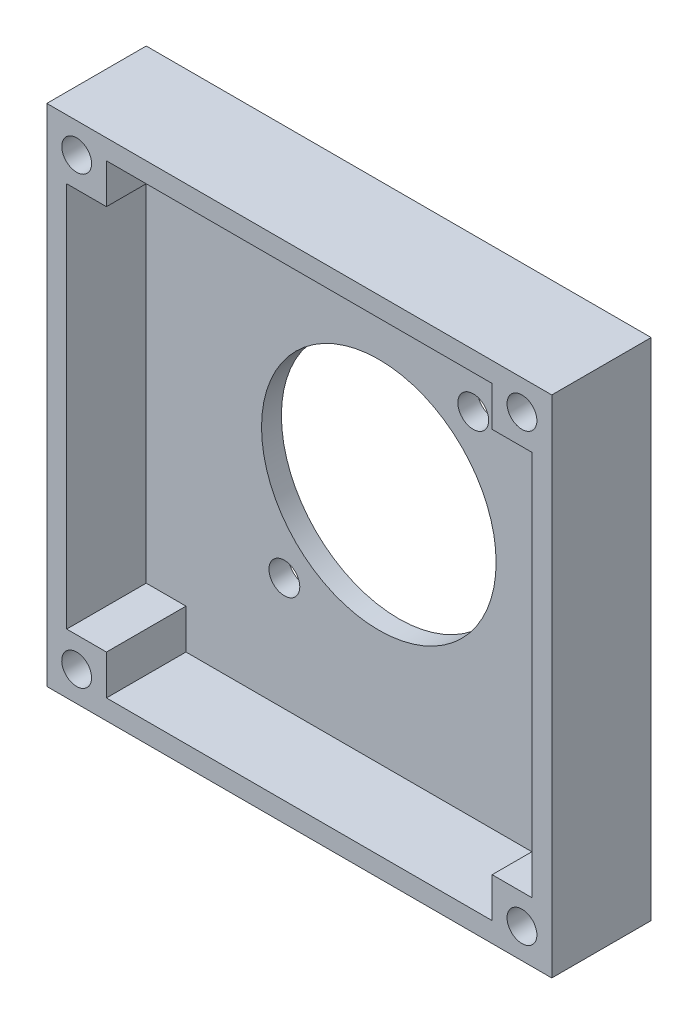
ISO-10303-21;
HEADER;
FILE_DESCRIPTION(('STEP AP214'),'2;1');
FILE_NAME('part.step','',(''),(''),'','','');
FILE_SCHEMA(('AUTOMOTIVE_DESIGN { 1 0 10303 214 1 1 1 1 }'));
ENDSEC;
DATA;
#1=APPLICATION_CONTEXT('core data for automotive mechanical design processes');
#2=APPLICATION_PROTOCOL_DEFINITION('international standard','automotive_design',2000,#1);
#3=PRODUCT_CONTEXT('',#1,'mechanical');
#4=PRODUCT('Part','Part','',(#3));
#5=PRODUCT_RELATED_PRODUCT_CATEGORY('part','',(#4));
#6=PRODUCT_DEFINITION_FORMATION('','',#4);
#7=PRODUCT_DEFINITION_CONTEXT('part definition',#1,'design');
#8=PRODUCT_DEFINITION('design','',#6,#7);
#9=PRODUCT_DEFINITION_SHAPE('','',#8);
#10=(LENGTH_UNIT() NAMED_UNIT(*) SI_UNIT(.MILLI.,.METRE.));
#11=(NAMED_UNIT(*) PLANE_ANGLE_UNIT() SI_UNIT($,.RADIAN.));
#12=(NAMED_UNIT(*) SI_UNIT($,.STERADIAN.) SOLID_ANGLE_UNIT());
#13=UNCERTAINTY_MEASURE_WITH_UNIT(LENGTH_MEASURE(1.E-05),#10,'distance_accuracy_value','');
#14=(GEOMETRIC_REPRESENTATION_CONTEXT(3) GLOBAL_UNCERTAINTY_ASSIGNED_CONTEXT((#13)) GLOBAL_UNIT_ASSIGNED_CONTEXT((#10,
#11,#12)) REPRESENTATION_CONTEXT('',''));
#15=CARTESIAN_POINT('',(0.,0.,0.));
#16=DIRECTION('',(0.,0.,1.));
#17=DIRECTION('',(1.,0.,0.));
#18=AXIS2_PLACEMENT_3D('',#15,#16,#17);
#19=CARTESIAN_POINT('',(0.,0.,2.));
#20=DIRECTION('',(0.,0.,-1.));
#21=DIRECTION('',(-1.,0.,0.));
#22=AXIS2_PLACEMENT_3D('',#19,#20,#21);
#23=PLANE('',#22);
#24=DIRECTION('',(1.,0.,0.));
#25=VECTOR('',#24,1.);
#26=CARTESIAN_POINT('',(0.,23.4,2.));
#27=LINE('',#26,#25);
#28=CARTESIAN_POINT('',(-19.4,23.4,2.));
#29=VERTEX_POINT('',#28);
#30=CARTESIAN_POINT('',(19.4,23.4,2.));
#31=VERTEX_POINT('',#30);
#32=EDGE_CURVE('E669',#29,#31,#27,.T.);
#33=ORIENTED_EDGE('',*,*,#32,.F.);
#34=DIRECTION('',(0.,-1.,0.));
#35=VECTOR('',#34,1.);
#36=CARTESIAN_POINT('',(-19.4,0.,2.));
#37=LINE('',#36,#35);
#38=CARTESIAN_POINT('',(-19.4,19.4,2.));
#39=VERTEX_POINT('',#38);
#40=EDGE_CURVE('E672',#29,#39,#37,.T.);
#41=ORIENTED_EDGE('',*,*,#40,.T.);
#42=DIRECTION('',(1.,0.,0.));
#43=VECTOR('',#42,1.);
#44=CARTESIAN_POINT('',(0.,19.4,2.));
#45=LINE('',#44,#43);
#46=CARTESIAN_POINT('',(-23.4,19.4,2.));
#47=VERTEX_POINT('',#46);
#48=EDGE_CURVE('E640',#47,#39,#45,.T.);
#49=ORIENTED_EDGE('',*,*,#48,.F.);
#50=DIRECTION('',(0.,1.,0.));
#51=VECTOR('',#50,1.);
#52=CARTESIAN_POINT('',(-23.4,0.,2.));
#53=LINE('',#52,#51);
#54=CARTESIAN_POINT('',(-23.4,-19.4,2.));
#55=VERTEX_POINT('',#54);
#56=EDGE_CURVE('E647',#55,#47,#53,.T.);
#57=ORIENTED_EDGE('',*,*,#56,.F.);
#58=DIRECTION('',(1.,0.,0.));
#59=VECTOR('',#58,1.);
#60=CARTESIAN_POINT('',(0.,-19.4,2.));
#61=LINE('',#60,#59);
#62=CARTESIAN_POINT('',(-19.4,-19.4,2.));
#63=VERTEX_POINT('',#62);
#64=EDGE_CURVE('E650',#55,#63,#61,.T.);
#65=ORIENTED_EDGE('',*,*,#64,.T.);
#66=DIRECTION('',(0.,1.,0.));
#67=VECTOR('',#66,1.);
#68=CARTESIAN_POINT('',(-19.4,0.,2.));
#69=LINE('',#68,#67);
#70=CARTESIAN_POINT('',(-19.4,-23.4,2.));
#71=VERTEX_POINT('',#70);
#72=EDGE_CURVE('E652',#71,#63,#69,.T.);
#73=ORIENTED_EDGE('',*,*,#72,.F.);
#74=DIRECTION('',(1.,0.,0.));
#75=VECTOR('',#74,1.);
#76=CARTESIAN_POINT('',(0.,-23.4,2.));
#77=LINE('',#76,#75);
#78=CARTESIAN_POINT('',(19.4,-23.4,2.));
#79=VERTEX_POINT('',#78);
#80=EDGE_CURVE('E655',#71,#79,#77,.T.);
#81=ORIENTED_EDGE('',*,*,#80,.T.);
#82=DIRECTION('',(0.,1.,0.));
#83=VECTOR('',#82,1.);
#84=CARTESIAN_POINT('',(19.4,0.,2.));
#85=LINE('',#84,#83);
#86=CARTESIAN_POINT('',(19.4,-19.4,2.));
#87=VERTEX_POINT('',#86);
#88=EDGE_CURVE('E657',#79,#87,#85,.T.);
#89=ORIENTED_EDGE('',*,*,#88,.T.);
#90=DIRECTION('',(-1.,0.,0.));
#91=VECTOR('',#90,1.);
#92=CARTESIAN_POINT('',(0.,-19.4,2.));
#93=LINE('',#92,#91);
#94=CARTESIAN_POINT('',(23.4,-19.4,2.));
#95=VERTEX_POINT('',#94);
#96=EDGE_CURVE('E659',#95,#87,#93,.T.);
#97=ORIENTED_EDGE('',*,*,#96,.F.);
#98=DIRECTION('',(0.,1.,0.));
#99=VECTOR('',#98,1.);
#100=CARTESIAN_POINT('',(23.4,0.,2.));
#101=LINE('',#100,#99);
#102=CARTESIAN_POINT('',(23.4,19.4,2.));
#103=VERTEX_POINT('',#102);
#104=EDGE_CURVE('E662',#95,#103,#101,.T.);
#105=ORIENTED_EDGE('',*,*,#104,.T.);
#106=DIRECTION('',(-1.,0.,0.));
#107=VECTOR('',#106,1.);
#108=CARTESIAN_POINT('',(0.,19.4,2.));
#109=LINE('',#108,#107);
#110=CARTESIAN_POINT('',(19.4,19.4,2.));
#111=VERTEX_POINT('',#110);
#112=EDGE_CURVE('E664',#103,#111,#109,.T.);
#113=ORIENTED_EDGE('',*,*,#112,.T.);
#114=DIRECTION('',(0.,-1.,0.));
#115=VECTOR('',#114,1.);
#116=CARTESIAN_POINT('',(19.4,0.,2.));
#117=LINE('',#116,#115);
#118=EDGE_CURVE('E666',#31,#111,#117,.T.);
#119=ORIENTED_EDGE('',*,*,#118,.F.);
#120=EDGE_LOOP('',(#33,#41,#49,#57,#65,#73,#81,#89,#97,#105,#113,#119));
#121=FACE_BOUND('',#120,.T.);
#122=CARTESIAN_POINT('',(0.,0.,2.));
#123=DIRECTION('',(0.,0.,1.));
#124=DIRECTION('',(1.,0.,0.));
#125=AXIS2_PLACEMENT_3D('',#122,#123,#124);
#126=CIRCLE('',#125,11.8);
#127=CARTESIAN_POINT('',(11.8,0.,2.));
#128=VERTEX_POINT('',#127);
#129=EDGE_CURVE('E558',#128,#128,#126,.T.);
#130=ORIENTED_EDGE('',*,*,#129,.F.);
#131=EDGE_LOOP('',(#130));
#132=FACE_BOUND('',#131,.T.);
#133=CARTESIAN_POINT('',(-9.5,-12.,2.));
#134=DIRECTION('',(0.,0.,1.));
#135=DIRECTION('',(1.,0.,0.));
#136=AXIS2_PLACEMENT_3D('',#133,#134,#135);
#137=CIRCLE('',#136,1.55);
#138=CARTESIAN_POINT('',(-7.94999999999999,-12.,2.));
#139=VERTEX_POINT('',#138);
#140=EDGE_CURVE('E681',#139,#139,#137,.T.);
#141=ORIENTED_EDGE('',*,*,#140,.F.);
#142=EDGE_LOOP('',(#141));
#143=FACE_BOUND('',#142,.T.);
#144=CARTESIAN_POINT('',(9.5,12.,2.));
#145=DIRECTION('',(0.,0.,1.));
#146=DIRECTION('',(1.,0.,0.));
#147=AXIS2_PLACEMENT_3D('',#144,#145,#146);
#148=CIRCLE('',#147,1.55);
#149=CARTESIAN_POINT('',(11.05,12.,2.));
#150=VERTEX_POINT('',#149);
#151=EDGE_CURVE('E675',#150,#150,#148,.T.);
#152=ORIENTED_EDGE('',*,*,#151,.F.);
#153=EDGE_LOOP('',(#152));
#154=FACE_BOUND('',#153,.T.);
#155=ADVANCED_FACE('F35',(#121,#132,#143,#154),#23,.F.);
#156=CARTESIAN_POINT('',(0.,0.,0.));
#157=DIRECTION('',(0.,0.,-1.));
#158=DIRECTION('',(-1.,0.,0.));
#159=AXIS2_PLACEMENT_3D('',#156,#157,#158);
#160=PLANE('',#159);
#161=CARTESIAN_POINT('',(-22.4,-22.5292564643802,0.));
#162=DIRECTION('',(0.,0.,1.));
#163=DIRECTION('',(-1.,0.,0.));
#164=AXIS2_PLACEMENT_3D('',#161,#162,#163);
#165=CIRCLE('',#164,1.5);
#166=CARTESIAN_POINT('',(-23.9,-22.5292564643802,0.));
#167=VERTEX_POINT('',#166);
#168=EDGE_CURVE('E163',#167,#167,#165,.T.);
#169=ORIENTED_EDGE('',*,*,#168,.T.);
#170=EDGE_LOOP('',(#169));
#171=FACE_BOUND('',#170,.T.);
#172=CARTESIAN_POINT('',(22.4,-22.5292564643802,0.));
#173=DIRECTION('',(0.,0.,1.));
#174=DIRECTION('',(1.,0.,0.));
#175=AXIS2_PLACEMENT_3D('',#172,#173,#174);
#176=CIRCLE('',#175,1.5);
#177=CARTESIAN_POINT('',(23.9,-22.5292564643802,0.));
#178=VERTEX_POINT('',#177);
#179=EDGE_CURVE('E169',#178,#178,#176,.T.);
#180=ORIENTED_EDGE('',*,*,#179,.T.);
#181=EDGE_LOOP('',(#180));
#182=FACE_BOUND('',#181,.T.);
#183=CARTESIAN_POINT('',(22.4,22.4,0.));
#184=DIRECTION('',(0.,0.,1.));
#185=DIRECTION('',(-1.,0.,0.));
#186=AXIS2_PLACEMENT_3D('',#183,#184,#185);
#187=CIRCLE('',#186,1.5);
#188=CARTESIAN_POINT('',(20.9,22.4,0.));
#189=VERTEX_POINT('',#188);
#190=EDGE_CURVE('E713',#189,#189,#187,.T.);
#191=ORIENTED_EDGE('',*,*,#190,.T.);
#192=EDGE_LOOP('',(#191));
#193=FACE_BOUND('',#192,.T.);
#194=CARTESIAN_POINT('',(-22.4,22.4,0.));
#195=DIRECTION('',(0.,0.,1.));
#196=DIRECTION('',(1.,0.,0.));
#197=AXIS2_PLACEMENT_3D('',#194,#195,#196);
#198=CIRCLE('',#197,1.5);
#199=CARTESIAN_POINT('',(-20.9,22.4,0.));
#200=VERTEX_POINT('',#199);
#201=EDGE_CURVE('E708',#200,#200,#198,.T.);
#202=ORIENTED_EDGE('',*,*,#201,.T.);
#203=EDGE_LOOP('',(#202));
#204=FACE_BOUND('',#203,.T.);
#205=CARTESIAN_POINT('',(-9.5,-12.,0.));
#206=DIRECTION('',(0.,0.,1.));
#207=DIRECTION('',(1.,0.,0.));
#208=AXIS2_PLACEMENT_3D('',#205,#206,#207);
#209=CIRCLE('',#208,1.55);
#210=CARTESIAN_POINT('',(-7.94999999999999,-12.,0.));
#211=VERTEX_POINT('',#210);
#212=EDGE_CURVE('E678',#211,#211,#209,.T.);
#213=ORIENTED_EDGE('',*,*,#212,.T.);
#214=EDGE_LOOP('',(#213));
#215=FACE_BOUND('',#214,.T.);
#216=CARTESIAN_POINT('',(0.,0.,0.));
#217=DIRECTION('',(0.,0.,1.));
#218=DIRECTION('',(1.,0.,0.));
#219=AXIS2_PLACEMENT_3D('',#216,#217,#218);
#220=CIRCLE('',#219,11.8);
#221=CARTESIAN_POINT('',(11.8,0.,0.));
#222=VERTEX_POINT('',#221);
#223=EDGE_CURVE('E563',#222,#222,#220,.T.);
#224=ORIENTED_EDGE('',*,*,#223,.T.);
#225=EDGE_LOOP('',(#224));
#226=FACE_BOUND('',#225,.T.);
#227=CARTESIAN_POINT('',(9.5,12.,0.));
#228=DIRECTION('',(0.,0.,1.));
#229=DIRECTION('',(1.,0.,0.));
#230=AXIS2_PLACEMENT_3D('',#227,#228,#229);
#231=CIRCLE('',#230,1.55);
#232=CARTESIAN_POINT('',(11.05,12.,0.));
#233=VERTEX_POINT('',#232);
#234=EDGE_CURVE('E674',#233,#233,#231,.T.);
#235=ORIENTED_EDGE('',*,*,#234,.T.);
#236=EDGE_LOOP('',(#235));
#237=FACE_BOUND('',#236,.T.);
#238=DIRECTION('',(0.,1.,0.));
#239=VECTOR('',#238,1.);
#240=CARTESIAN_POINT('',(25.4,-25.4,0.));
#241=LINE('',#240,#239);
#242=CARTESIAN_POINT('',(25.4,-25.4,0.));
#243=VERTEX_POINT('',#242);
#244=CARTESIAN_POINT('',(25.4,25.4,0.));
#245=VERTEX_POINT('',#244);
#246=EDGE_CURVE('E550',#243,#245,#241,.T.);
#247=ORIENTED_EDGE('',*,*,#246,.F.);
#248=DIRECTION('',(1.,0.,0.));
#249=VECTOR('',#248,1.);
#250=CARTESIAN_POINT('',(-25.4,-25.4,0.));
#251=LINE('',#250,#249);
#252=CARTESIAN_POINT('',(-25.4,-25.4,0.));
#253=VERTEX_POINT('',#252);
#254=EDGE_CURVE('E568',#253,#243,#251,.T.);
#255=ORIENTED_EDGE('',*,*,#254,.F.);
#256=DIRECTION('',(0.,-1.,0.));
#257=VECTOR('',#256,1.);
#258=CARTESIAN_POINT('',(-25.4,-25.4,0.));
#259=LINE('',#258,#257);
#260=CARTESIAN_POINT('',(-25.4,25.4,0.));
#261=VERTEX_POINT('',#260);
#262=EDGE_CURVE('E560',#261,#253,#259,.T.);
#263=ORIENTED_EDGE('',*,*,#262,.F.);
#264=DIRECTION('',(-1.,0.,0.));
#265=VECTOR('',#264,1.);
#266=CARTESIAN_POINT('',(-25.4,25.4,0.));
#267=LINE('',#266,#265);
#268=EDGE_CURVE('E557',#245,#261,#267,.T.);
#269=ORIENTED_EDGE('',*,*,#268,.F.);
#270=EDGE_LOOP('',(#247,#255,#263,#269));
#271=FACE_BOUND('',#270,.T.);
#272=ADVANCED_FACE('F190',(#171,#182,#193,#204,#215,#226,#237,#271),#160,.T.);
#273=CARTESIAN_POINT('',(25.4,-25.4,2.));
#274=DIRECTION('',(-1.,0.,0.));
#275=DIRECTION('',(0.,0.,1.));
#276=AXIS2_PLACEMENT_3D('',#273,#274,#275);
#277=PLANE('',#276);
#278=ORIENTED_EDGE('',*,*,#246,.T.);
#279=DIRECTION('',(0.,0.,-1.));
#280=VECTOR('',#279,1.);
#281=CARTESIAN_POINT('',(25.4,25.4,2.));
#282=LINE('',#281,#280);
#283=CARTESIAN_POINT('',(25.4,25.4,10.));
#284=VERTEX_POINT('',#283);
#285=EDGE_CURVE('E39',#284,#245,#282,.T.);
#286=ORIENTED_EDGE('',*,*,#285,.F.);
#287=DIRECTION('',(0.,1.,0.));
#288=VECTOR('',#287,1.);
#289=CARTESIAN_POINT('',(25.4,0.,10.));
#290=LINE('',#289,#288);
#291=CARTESIAN_POINT('',(25.4,-25.4,10.));
#292=VERTEX_POINT('',#291);
#293=EDGE_CURVE('E594',#292,#284,#290,.T.);
#294=ORIENTED_EDGE('',*,*,#293,.F.);
#295=DIRECTION('',(0.,0.,-1.));
#296=VECTOR('',#295,1.);
#297=CARTESIAN_POINT('',(25.4,-25.4,2.));
#298=LINE('',#297,#296);
#299=EDGE_CURVE('E554',#292,#243,#298,.T.);
#300=ORIENTED_EDGE('',*,*,#299,.T.);
#301=EDGE_LOOP('',(#278,#286,#294,#300));
#302=FACE_BOUND('',#301,.T.);
#303=ADVANCED_FACE('F37',(#302),#277,.F.);
#304=CARTESIAN_POINT('',(-25.4,25.4,2.));
#305=DIRECTION('',(0.,-1.,0.));
#306=DIRECTION('',(0.,0.,-1.));
#307=AXIS2_PLACEMENT_3D('',#304,#305,#306);
#308=PLANE('',#307);
#309=ORIENTED_EDGE('',*,*,#268,.T.);
#310=DIRECTION('',(0.,0.,-1.));
#311=VECTOR('',#310,1.);
#312=CARTESIAN_POINT('',(-25.4,25.4,2.));
#313=LINE('',#312,#311);
#314=CARTESIAN_POINT('',(-25.4,25.4,10.));
#315=VERTEX_POINT('',#314);
#316=EDGE_CURVE('E573',#315,#261,#313,.T.);
#317=ORIENTED_EDGE('',*,*,#316,.F.);
#318=DIRECTION('',(1.,0.,0.));
#319=VECTOR('',#318,1.);
#320=CARTESIAN_POINT('',(0.,25.4,10.));
#321=LINE('',#320,#319);
#322=EDGE_CURVE('E579',#315,#284,#321,.T.);
#323=ORIENTED_EDGE('',*,*,#322,.T.);
#324=ORIENTED_EDGE('',*,*,#285,.T.);
#325=EDGE_LOOP('',(#309,#317,#323,#324));
#326=FACE_BOUND('',#325,.T.);
#327=ADVANCED_FACE('F430',(#326),#308,.F.);
#328=CARTESIAN_POINT('',(-25.4,-25.4,2.));
#329=DIRECTION('',(1.,0.,0.));
#330=DIRECTION('',(0.,0.,-1.));
#331=AXIS2_PLACEMENT_3D('',#328,#329,#330);
#332=PLANE('',#331);
#333=ORIENTED_EDGE('',*,*,#262,.T.);
#334=DIRECTION('',(0.,0.,-1.));
#335=VECTOR('',#334,1.);
#336=CARTESIAN_POINT('',(-25.4,-25.4,2.));
#337=LINE('',#336,#335);
#338=CARTESIAN_POINT('',(-25.4,-25.4,10.));
#339=VERTEX_POINT('',#338);
#340=EDGE_CURVE('E571',#339,#253,#337,.T.);
#341=ORIENTED_EDGE('',*,*,#340,.F.);
#342=DIRECTION('',(0.,1.,0.));
#343=VECTOR('',#342,1.);
#344=CARTESIAN_POINT('',(-25.4,0.,10.));
#345=LINE('',#344,#343);
#346=EDGE_CURVE('E582',#339,#315,#345,.T.);
#347=ORIENTED_EDGE('',*,*,#346,.T.);
#348=ORIENTED_EDGE('',*,*,#316,.T.);
#349=EDGE_LOOP('',(#333,#341,#347,#348));
#350=FACE_BOUND('',#349,.T.);
#351=ADVANCED_FACE('F422',(#350),#332,.F.);
#352=CARTESIAN_POINT('',(-25.4,-25.4,2.));
#353=DIRECTION('',(0.,1.,0.));
#354=DIRECTION('',(0.,0.,1.));
#355=AXIS2_PLACEMENT_3D('',#352,#353,#354);
#356=PLANE('',#355);
#357=ORIENTED_EDGE('',*,*,#254,.T.);
#358=ORIENTED_EDGE('',*,*,#299,.F.);
#359=DIRECTION('',(1.,0.,0.));
#360=VECTOR('',#359,1.);
#361=CARTESIAN_POINT('',(0.,-25.4,10.));
#362=LINE('',#361,#360);
#363=EDGE_CURVE('E585',#339,#292,#362,.T.);
#364=ORIENTED_EDGE('',*,*,#363,.F.);
#365=ORIENTED_EDGE('',*,*,#340,.T.);
#366=EDGE_LOOP('',(#357,#358,#364,#365));
#367=FACE_BOUND('',#366,.T.);
#368=ADVANCED_FACE('F416',(#367),#356,.F.);
#369=CARTESIAN_POINT('',(0.,0.,2.));
#370=DIRECTION('',(0.,0.,-1.));
#371=DIRECTION('',(-1.,0.,0.));
#372=AXIS2_PLACEMENT_3D('',#369,#370,#371);
#373=CYLINDRICAL_SURFACE('',#372,11.8);
#374=ORIENTED_EDGE('',*,*,#129,.T.);
#375=EDGE_LOOP('',(#374));
#376=FACE_BOUND('',#375,.T.);
#377=ORIENTED_EDGE('',*,*,#223,.F.);
#378=EDGE_LOOP('',(#377));
#379=FACE_BOUND('',#378,.T.);
#380=ADVANCED_FACE('F408',(#376,#379),#373,.F.);
#381=CARTESIAN_POINT('',(-9.5,-12.,2.));
#382=DIRECTION('',(0.,0.,-1.));
#383=DIRECTION('',(-1.,0.,0.));
#384=AXIS2_PLACEMENT_3D('',#381,#382,#383);
#385=CYLINDRICAL_SURFACE('',#384,1.55);
#386=ORIENTED_EDGE('',*,*,#140,.T.);
#387=EDGE_LOOP('',(#386));
#388=FACE_BOUND('',#387,.T.);
#389=ORIENTED_EDGE('',*,*,#212,.F.);
#390=EDGE_LOOP('',(#389));
#391=FACE_BOUND('',#390,.T.);
#392=ADVANCED_FACE('F400',(#388,#391),#385,.F.);
#393=CARTESIAN_POINT('',(9.5,12.,2.));
#394=DIRECTION('',(0.,0.,-1.));
#395=DIRECTION('',(-1.,0.,0.));
#396=AXIS2_PLACEMENT_3D('',#393,#394,#395);
#397=CYLINDRICAL_SURFACE('',#396,1.55);
#398=ORIENTED_EDGE('',*,*,#151,.T.);
#399=EDGE_LOOP('',(#398));
#400=FACE_BOUND('',#399,.T.);
#401=ORIENTED_EDGE('',*,*,#234,.F.);
#402=EDGE_LOOP('',(#401));
#403=FACE_BOUND('',#402,.T.);
#404=ADVANCED_FACE('F391',(#400,#403),#397,.F.);
#405=CARTESIAN_POINT('',(-19.4,0.,10.));
#406=DIRECTION('',(1.,0.,0.));
#407=DIRECTION('',(0.,0.,-1.));
#408=AXIS2_PLACEMENT_3D('',#405,#406,#407);
#409=PLANE('',#408);
#410=ORIENTED_EDGE('',*,*,#40,.F.);
#411=DIRECTION('',(0.,0.,-1.));
#412=VECTOR('',#411,1.);
#413=CARTESIAN_POINT('',(-19.4,23.4,10.));
#414=LINE('',#413,#412);
#415=CARTESIAN_POINT('',(-19.4,23.4,10.));
#416=VERTEX_POINT('',#415);
#417=EDGE_CURVE('E638',#416,#29,#414,.T.);
#418=ORIENTED_EDGE('',*,*,#417,.F.);
#419=DIRECTION('',(0.,-1.,0.));
#420=VECTOR('',#419,1.);
#421=CARTESIAN_POINT('',(-19.4,0.,10.));
#422=LINE('',#421,#420);
#423=CARTESIAN_POINT('',(-19.4,19.4,10.));
#424=VERTEX_POINT('',#423);
#425=EDGE_CURVE('E705',#416,#424,#422,.T.);
#426=ORIENTED_EDGE('',*,*,#425,.T.);
#427=DIRECTION('',(0.,0.,-1.));
#428=VECTOR('',#427,1.);
#429=CARTESIAN_POINT('',(-19.4,19.4,10.));
#430=LINE('',#429,#428);
#431=EDGE_CURVE('E605',#424,#39,#430,.T.);
#432=ORIENTED_EDGE('',*,*,#431,.T.);
#433=EDGE_LOOP('',(#410,#418,#426,#432));
#434=FACE_BOUND('',#433,.T.);
#435=ADVANCED_FACE('F383',(#434),#409,.T.);
#436=CARTESIAN_POINT('',(0.,23.4,10.));
#437=DIRECTION('',(0.,1.,0.));
#438=DIRECTION('',(0.,0.,1.));
#439=AXIS2_PLACEMENT_3D('',#436,#437,#438);
#440=PLANE('',#439);
#441=ORIENTED_EDGE('',*,*,#417,.T.);
#442=ORIENTED_EDGE('',*,*,#32,.T.);
#443=DIRECTION('',(0.,0.,-1.));
#444=VECTOR('',#443,1.);
#445=CARTESIAN_POINT('',(19.4,23.4,10.));
#446=LINE('',#445,#444);
#447=CARTESIAN_POINT('',(19.4,23.4,10.));
#448=VERTEX_POINT('',#447);
#449=EDGE_CURVE('E635',#448,#31,#446,.T.);
#450=ORIENTED_EDGE('',*,*,#449,.F.);
#451=DIRECTION('',(1.,0.,0.));
#452=VECTOR('',#451,1.);
#453=CARTESIAN_POINT('',(0.,23.4,10.));
#454=LINE('',#453,#452);
#455=EDGE_CURVE('E707',#416,#448,#454,.T.);
#456=ORIENTED_EDGE('',*,*,#455,.F.);
#457=EDGE_LOOP('',(#441,#442,#450,#456));
#458=FACE_BOUND('',#457,.T.);
#459=ADVANCED_FACE('F375',(#458),#440,.F.);
#460=CARTESIAN_POINT('',(19.4,0.,10.));
#461=DIRECTION('',(1.,0.,0.));
#462=DIRECTION('',(0.,0.,-1.));
#463=AXIS2_PLACEMENT_3D('',#460,#461,#462);
#464=PLANE('',#463);
#465=ORIENTED_EDGE('',*,*,#449,.T.);
#466=ORIENTED_EDGE('',*,*,#118,.T.);
#467=DIRECTION('',(0.,0.,-1.));
#468=VECTOR('',#467,1.);
#469=CARTESIAN_POINT('',(19.4,19.4,10.));
#470=LINE('',#469,#468);
#471=CARTESIAN_POINT('',(19.4,19.4,10.));
#472=VERTEX_POINT('',#471);
#473=EDGE_CURVE('E632',#472,#111,#470,.T.);
#474=ORIENTED_EDGE('',*,*,#473,.F.);
#475=DIRECTION('',(0.,-1.,0.));
#476=VECTOR('',#475,1.);
#477=CARTESIAN_POINT('',(19.4,0.,10.));
#478=LINE('',#477,#476);
#479=EDGE_CURVE('E710',#448,#472,#478,.T.);
#480=ORIENTED_EDGE('',*,*,#479,.F.);
#481=EDGE_LOOP('',(#465,#466,#474,#480));
#482=FACE_BOUND('',#481,.T.);
#483=ADVANCED_FACE('F367',(#482),#464,.F.);
#484=CARTESIAN_POINT('',(0.,19.4,10.));
#485=DIRECTION('',(0.,-1.,0.));
#486=DIRECTION('',(0.,0.,-1.));
#487=AXIS2_PLACEMENT_3D('',#484,#485,#486);
#488=PLANE('',#487);
#489=ORIENTED_EDGE('',*,*,#112,.F.);
#490=DIRECTION('',(0.,0.,-1.));
#491=VECTOR('',#490,1.);
#492=CARTESIAN_POINT('',(23.4,19.4,10.));
#493=LINE('',#492,#491);
#494=CARTESIAN_POINT('',(23.4,19.4,10.));
#495=VERTEX_POINT('',#494);
#496=EDGE_CURVE('E629',#495,#103,#493,.T.);
#497=ORIENTED_EDGE('',*,*,#496,.F.);
#498=DIRECTION('',(-1.,0.,0.));
#499=VECTOR('',#498,1.);
#500=CARTESIAN_POINT('',(0.,19.4,10.));
#501=LINE('',#500,#499);
#502=EDGE_CURVE('E718',#495,#472,#501,.T.);
#503=ORIENTED_EDGE('',*,*,#502,.T.);
#504=ORIENTED_EDGE('',*,*,#473,.T.);
#505=EDGE_LOOP('',(#489,#497,#503,#504));
#506=FACE_BOUND('',#505,.T.);
#507=ADVANCED_FACE('F359',(#506),#488,.T.);
#508=CARTESIAN_POINT('',(23.4,0.,10.));
#509=DIRECTION('',(-1.,0.,0.));
#510=DIRECTION('',(0.,0.,1.));
#511=AXIS2_PLACEMENT_3D('',#508,#509,#510);
#512=PLANE('',#511);
#513=ORIENTED_EDGE('',*,*,#104,.F.);
#514=DIRECTION('',(0.,0.,-1.));
#515=VECTOR('',#514,1.);
#516=CARTESIAN_POINT('',(23.4,-19.4,10.));
#517=LINE('',#516,#515);
#518=CARTESIAN_POINT('',(23.4,-19.4,10.));
#519=VERTEX_POINT('',#518);
#520=EDGE_CURVE('E626',#519,#95,#517,.T.);
#521=ORIENTED_EDGE('',*,*,#520,.F.);
#522=DIRECTION('',(0.,1.,0.));
#523=VECTOR('',#522,1.);
#524=CARTESIAN_POINT('',(23.4,0.,10.));
#525=LINE('',#524,#523);
#526=EDGE_CURVE('E721',#519,#495,#525,.T.);
#527=ORIENTED_EDGE('',*,*,#526,.T.);
#528=ORIENTED_EDGE('',*,*,#496,.T.);
#529=EDGE_LOOP('',(#513,#521,#527,#528));
#530=FACE_BOUND('',#529,.T.);
#531=ADVANCED_FACE('F351',(#530),#512,.T.);
#532=CARTESIAN_POINT('',(0.,-19.4,10.));
#533=DIRECTION('',(0.,-1.,0.));
#534=DIRECTION('',(0.,0.,-1.));
#535=AXIS2_PLACEMENT_3D('',#532,#533,#534);
#536=PLANE('',#535);
#537=ORIENTED_EDGE('',*,*,#520,.T.);
#538=ORIENTED_EDGE('',*,*,#96,.T.);
#539=DIRECTION('',(0.,0.,-1.));
#540=VECTOR('',#539,1.);
#541=CARTESIAN_POINT('',(19.4,-19.4,10.));
#542=LINE('',#541,#540);
#543=CARTESIAN_POINT('',(19.4,-19.4,10.));
#544=VERTEX_POINT('',#543);
#545=EDGE_CURVE('E623',#544,#87,#542,.T.);
#546=ORIENTED_EDGE('',*,*,#545,.F.);
#547=DIRECTION('',(-1.,0.,0.));
#548=VECTOR('',#547,1.);
#549=CARTESIAN_POINT('',(0.,-19.4,10.));
#550=LINE('',#549,#548);
#551=EDGE_CURVE('E724',#519,#544,#550,.T.);
#552=ORIENTED_EDGE('',*,*,#551,.F.);
#553=EDGE_LOOP('',(#537,#538,#546,#552));
#554=FACE_BOUND('',#553,.T.);
#555=ADVANCED_FACE('F343',(#554),#536,.F.);
#556=CARTESIAN_POINT('',(19.4,0.,10.));
#557=DIRECTION('',(-1.,0.,0.));
#558=DIRECTION('',(0.,0.,1.));
#559=AXIS2_PLACEMENT_3D('',#556,#557,#558);
#560=PLANE('',#559);
#561=ORIENTED_EDGE('',*,*,#88,.F.);
#562=DIRECTION('',(0.,0.,-1.));
#563=VECTOR('',#562,1.);
#564=CARTESIAN_POINT('',(19.4,-23.4,10.));
#565=LINE('',#564,#563);
#566=CARTESIAN_POINT('',(19.4,-23.4,10.));
#567=VERTEX_POINT('',#566);
#568=EDGE_CURVE('E620',#567,#79,#565,.T.);
#569=ORIENTED_EDGE('',*,*,#568,.F.);
#570=DIRECTION('',(0.,1.,0.));
#571=VECTOR('',#570,1.);
#572=CARTESIAN_POINT('',(19.4,0.,10.));
#573=LINE('',#572,#571);
#574=EDGE_CURVE('E726',#567,#544,#573,.T.);
#575=ORIENTED_EDGE('',*,*,#574,.T.);
#576=ORIENTED_EDGE('',*,*,#545,.T.);
#577=EDGE_LOOP('',(#561,#569,#575,#576));
#578=FACE_BOUND('',#577,.T.);
#579=ADVANCED_FACE('F335',(#578),#560,.T.);
#580=CARTESIAN_POINT('',(0.,-23.4,10.));
#581=DIRECTION('',(0.,1.,0.));
#582=DIRECTION('',(0.,0.,1.));
#583=AXIS2_PLACEMENT_3D('',#580,#581,#582);
#584=PLANE('',#583);
#585=ORIENTED_EDGE('',*,*,#80,.F.);
#586=DIRECTION('',(0.,0.,-1.));
#587=VECTOR('',#586,1.);
#588=CARTESIAN_POINT('',(-19.4,-23.4,10.));
#589=LINE('',#588,#587);
#590=CARTESIAN_POINT('',(-19.4,-23.4,10.));
#591=VERTEX_POINT('',#590);
#592=EDGE_CURVE('E617',#591,#71,#589,.T.);
#593=ORIENTED_EDGE('',*,*,#592,.F.);
#594=DIRECTION('',(1.,0.,0.));
#595=VECTOR('',#594,1.);
#596=CARTESIAN_POINT('',(0.,-23.4,10.));
#597=LINE('',#596,#595);
#598=EDGE_CURVE('E729',#591,#567,#597,.T.);
#599=ORIENTED_EDGE('',*,*,#598,.T.);
#600=ORIENTED_EDGE('',*,*,#568,.T.);
#601=EDGE_LOOP('',(#585,#593,#599,#600));
#602=FACE_BOUND('',#601,.T.);
#603=ADVANCED_FACE('F327',(#602),#584,.T.);
#604=CARTESIAN_POINT('',(-19.4,0.,10.));
#605=DIRECTION('',(-1.,0.,0.));
#606=DIRECTION('',(0.,0.,1.));
#607=AXIS2_PLACEMENT_3D('',#604,#605,#606);
#608=PLANE('',#607);
#609=ORIENTED_EDGE('',*,*,#592,.T.);
#610=ORIENTED_EDGE('',*,*,#72,.T.);
#611=DIRECTION('',(0.,0.,-1.));
#612=VECTOR('',#611,1.);
#613=CARTESIAN_POINT('',(-19.4,-19.4,10.));
#614=LINE('',#613,#612);
#615=CARTESIAN_POINT('',(-19.4,-19.4,10.));
#616=VERTEX_POINT('',#615);
#617=EDGE_CURVE('E614',#616,#63,#614,.T.);
#618=ORIENTED_EDGE('',*,*,#617,.F.);
#619=DIRECTION('',(0.,1.,0.));
#620=VECTOR('',#619,1.);
#621=CARTESIAN_POINT('',(-19.4,0.,10.));
#622=LINE('',#621,#620);
#623=EDGE_CURVE('E732',#591,#616,#622,.T.);
#624=ORIENTED_EDGE('',*,*,#623,.F.);
#625=EDGE_LOOP('',(#609,#610,#618,#624));
#626=FACE_BOUND('',#625,.T.);
#627=ADVANCED_FACE('F319',(#626),#608,.F.);
#628=CARTESIAN_POINT('',(0.,-19.4,10.));
#629=DIRECTION('',(0.,1.,0.));
#630=DIRECTION('',(0.,0.,1.));
#631=AXIS2_PLACEMENT_3D('',#628,#629,#630);
#632=PLANE('',#631);
#633=ORIENTED_EDGE('',*,*,#64,.F.);
#634=DIRECTION('',(0.,0.,-1.));
#635=VECTOR('',#634,1.);
#636=CARTESIAN_POINT('',(-23.4,-19.4,10.));
#637=LINE('',#636,#635);
#638=CARTESIAN_POINT('',(-23.4,-19.4,10.));
#639=VERTEX_POINT('',#638);
#640=EDGE_CURVE('E611',#639,#55,#637,.T.);
#641=ORIENTED_EDGE('',*,*,#640,.F.);
#642=DIRECTION('',(1.,0.,0.));
#643=VECTOR('',#642,1.);
#644=CARTESIAN_POINT('',(0.,-19.4,10.));
#645=LINE('',#644,#643);
#646=EDGE_CURVE('E734',#639,#616,#645,.T.);
#647=ORIENTED_EDGE('',*,*,#646,.T.);
#648=ORIENTED_EDGE('',*,*,#617,.T.);
#649=EDGE_LOOP('',(#633,#641,#647,#648));
#650=FACE_BOUND('',#649,.T.);
#651=ADVANCED_FACE('F312',(#650),#632,.T.);
#652=CARTESIAN_POINT('',(-23.4,0.,10.));
#653=DIRECTION('',(-1.,0.,0.));
#654=DIRECTION('',(0.,0.,1.));
#655=AXIS2_PLACEMENT_3D('',#652,#653,#654);
#656=PLANE('',#655);
#657=ORIENTED_EDGE('',*,*,#640,.T.);
#658=ORIENTED_EDGE('',*,*,#56,.T.);
#659=DIRECTION('',(0.,0.,-1.));
#660=VECTOR('',#659,1.);
#661=CARTESIAN_POINT('',(-23.4,19.4,10.));
#662=LINE('',#661,#660);
#663=CARTESIAN_POINT('',(-23.4,19.4,10.));
#664=VERTEX_POINT('',#663);
#665=EDGE_CURVE('E608',#664,#47,#662,.T.);
#666=ORIENTED_EDGE('',*,*,#665,.F.);
#667=DIRECTION('',(0.,1.,0.));
#668=VECTOR('',#667,1.);
#669=CARTESIAN_POINT('',(-23.4,0.,10.));
#670=LINE('',#669,#668);
#671=EDGE_CURVE('E737',#639,#664,#670,.T.);
#672=ORIENTED_EDGE('',*,*,#671,.F.);
#673=EDGE_LOOP('',(#657,#658,#666,#672));
#674=FACE_BOUND('',#673,.T.);
#675=ADVANCED_FACE('F300',(#674),#656,.F.);
#676=CARTESIAN_POINT('',(-22.4,-22.4,10.));
#677=DIRECTION('',(0.,0.,-1.));
#678=DIRECTION('',(-1.,0.,0.));
#679=AXIS2_PLACEMENT_3D('',#676,#677,#678);
#680=CYLINDRICAL_SURFACE('',#679,1.5);
#681=CARTESIAN_POINT('',(-22.4,-22.4,10.));
#682=DIRECTION('',(0.,0.,1.));
#683=DIRECTION('',(1.,0.,0.));
#684=AXIS2_PLACEMENT_3D('',#681,#682,#683);
#685=CIRCLE('',#684,1.5);
#686=CARTESIAN_POINT('',(-20.9,-22.4,10.));
#687=VERTEX_POINT('',#686);
#688=EDGE_CURVE('E599',#687,#687,#685,.T.);
#689=ORIENTED_EDGE('',*,*,#688,.T.);
#690=EDGE_LOOP('',(#689));
#691=FACE_BOUND('',#690,.T.);
#692=CARTESIAN_POINT('',(-22.4,-22.4,2.));
#693=DIRECTION('',(0.,0.,-1.));
#694=DIRECTION('',(-1.,0.,0.));
#695=AXIS2_PLACEMENT_3D('',#692,#693,#694);
#696=CIRCLE('',#695,1.5);
#697=CARTESIAN_POINT('',(-23.8986070837962,-22.4646282321901,2.));
#698=VERTEX_POINT('',#697);
#699=CARTESIAN_POINT('',(-20.9013929162039,-22.4646282321901,2.));
#700=VERTEX_POINT('',#699);
#701=EDGE_CURVE('E645',#698,#700,#696,.F.);
#702=ORIENTED_EDGE('',*,*,#701,.F.);
#703=EDGE_CURVE('E644',#700,#698,#696,.F.);
#704=ORIENTED_EDGE('',*,*,#703,.F.);
#705=EDGE_LOOP('',(#702,#704));
#706=FACE_BOUND('',#705,.T.);
#707=ADVANCED_FACE('F271',(#691,#706),#680,.F.);
#708=CARTESIAN_POINT('',(22.4,22.4,10.));
#709=DIRECTION('',(0.,0.,-1.));
#710=DIRECTION('',(-1.,0.,0.));
#711=AXIS2_PLACEMENT_3D('',#708,#709,#710);
#712=CYLINDRICAL_SURFACE('',#711,1.5);
#713=CARTESIAN_POINT('',(22.4,22.4,10.));
#714=DIRECTION('',(0.,0.,1.));
#715=DIRECTION('',(1.,0.,0.));
#716=AXIS2_PLACEMENT_3D('',#713,#714,#715);
#717=CIRCLE('',#716,1.5);
#718=CARTESIAN_POINT('',(23.9,22.4,10.));
#719=VERTEX_POINT('',#718);
#720=EDGE_CURVE('E596',#719,#719,#717,.F.);
#721=ORIENTED_EDGE('',*,*,#720,.F.);
#722=EDGE_LOOP('',(#721));
#723=FACE_BOUND('',#722,.T.);
#724=ORIENTED_EDGE('',*,*,#190,.F.);
#725=EDGE_LOOP('',(#724));
#726=FACE_BOUND('',#725,.T.);
#727=ADVANCED_FACE('F258',(#723,#726),#712,.F.);
#728=CARTESIAN_POINT('',(-22.4,22.4,10.));
#729=DIRECTION('',(0.,0.,-1.));
#730=DIRECTION('',(-1.,0.,0.));
#731=AXIS2_PLACEMENT_3D('',#728,#729,#730);
#732=CYLINDRICAL_SURFACE('',#731,1.5);
#733=CARTESIAN_POINT('',(-22.4,22.4,10.));
#734=DIRECTION('',(0.,0.,1.));
#735=DIRECTION('',(1.,0.,0.));
#736=AXIS2_PLACEMENT_3D('',#733,#734,#735);
#737=CIRCLE('',#736,1.5);
#738=CARTESIAN_POINT('',(-20.9,22.4,10.));
#739=VERTEX_POINT('',#738);
#740=EDGE_CURVE('E583',#739,#739,#737,.T.);
#741=ORIENTED_EDGE('',*,*,#740,.T.);
#742=EDGE_LOOP('',(#741));
#743=FACE_BOUND('',#742,.T.);
#744=ORIENTED_EDGE('',*,*,#201,.F.);
#745=EDGE_LOOP('',(#744));
#746=FACE_BOUND('',#745,.T.);
#747=ADVANCED_FACE('F184',(#743,#746),#732,.F.);
#748=CARTESIAN_POINT('',(0.,19.4,10.));
#749=DIRECTION('',(0.,1.,0.));
#750=DIRECTION('',(0.,0.,1.));
#751=AXIS2_PLACEMENT_3D('',#748,#749,#750);
#752=PLANE('',#751);
#753=ORIENTED_EDGE('',*,*,#665,.T.);
#754=ORIENTED_EDGE('',*,*,#48,.T.);
#755=ORIENTED_EDGE('',*,*,#431,.F.);
#756=DIRECTION('',(1.,0.,0.));
#757=VECTOR('',#756,1.);
#758=CARTESIAN_POINT('',(0.,19.4,10.));
#759=LINE('',#758,#757);
#760=EDGE_CURVE('E588',#664,#424,#759,.T.);
#761=ORIENTED_EDGE('',*,*,#760,.F.);
#762=EDGE_LOOP('',(#753,#754,#755,#761));
#763=FACE_BOUND('',#762,.T.);
#764=ADVANCED_FACE('F175',(#763),#752,.F.);
#765=CARTESIAN_POINT('',(22.4,-22.4,10.));
#766=DIRECTION('',(0.,0.,-1.));
#767=DIRECTION('',(-1.,0.,0.));
#768=AXIS2_PLACEMENT_3D('',#765,#766,#767);
#769=CYLINDRICAL_SURFACE('',#768,1.5);
#770=CARTESIAN_POINT('',(22.4,-22.4,10.));
#771=DIRECTION('',(0.,0.,1.));
#772=DIRECTION('',(1.,0.,0.));
#773=AXIS2_PLACEMENT_3D('',#770,#771,#772);
#774=CIRCLE('',#773,1.5);
#775=CARTESIAN_POINT('',(23.9,-22.4,10.));
#776=VERTEX_POINT('',#775);
#777=EDGE_CURVE('E602',#776,#776,#774,.F.);
#778=ORIENTED_EDGE('',*,*,#777,.F.);
#779=EDGE_LOOP('',(#778));
#780=FACE_BOUND('',#779,.T.);
#781=CARTESIAN_POINT('',(22.4,-22.4,2.));
#782=DIRECTION('',(0.,0.,-1.));
#783=DIRECTION('',(-1.,0.,0.));
#784=AXIS2_PLACEMENT_3D('',#781,#782,#783);
#785=CIRCLE('',#784,1.5);
#786=CARTESIAN_POINT('',(23.8986070837961,-22.46462823219,2.));
#787=VERTEX_POINT('',#786);
#788=CARTESIAN_POINT('',(20.9013929162039,-22.4646282321903,2.));
#789=VERTEX_POINT('',#788);
#790=EDGE_CURVE('E11',#787,#789,#785,.T.);
#791=ORIENTED_EDGE('',*,*,#790,.T.);
#792=EDGE_CURVE('E44',#789,#787,#785,.T.);
#793=ORIENTED_EDGE('',*,*,#792,.T.);
#794=EDGE_LOOP('',(#791,#793));
#795=FACE_BOUND('',#794,.T.);
#796=ADVANCED_FACE('F172',(#780,#795),#769,.F.);
#797=CARTESIAN_POINT('',(0.,0.,10.));
#798=DIRECTION('',(0.,0.,1.));
#799=DIRECTION('',(1.,0.,0.));
#800=AXIS2_PLACEMENT_3D('',#797,#798,#799);
#801=PLANE('',#800);
#802=ORIENTED_EDGE('',*,*,#425,.F.);
#803=ORIENTED_EDGE('',*,*,#455,.T.);
#804=ORIENTED_EDGE('',*,*,#479,.T.);
#805=ORIENTED_EDGE('',*,*,#502,.F.);
#806=ORIENTED_EDGE('',*,*,#526,.F.);
#807=ORIENTED_EDGE('',*,*,#551,.T.);
#808=ORIENTED_EDGE('',*,*,#574,.F.);
#809=ORIENTED_EDGE('',*,*,#598,.F.);
#810=ORIENTED_EDGE('',*,*,#623,.T.);
#811=ORIENTED_EDGE('',*,*,#646,.F.);
#812=ORIENTED_EDGE('',*,*,#671,.T.);
#813=ORIENTED_EDGE('',*,*,#760,.T.);
#814=EDGE_LOOP('',(#802,#803,#804,#805,#806,#807,#808,#809,#810,#811,#812,#813));
#815=FACE_BOUND('',#814,.T.);
#816=ORIENTED_EDGE('',*,*,#740,.F.);
#817=EDGE_LOOP('',(#816));
#818=FACE_BOUND('',#817,.T.);
#819=ORIENTED_EDGE('',*,*,#322,.F.);
#820=ORIENTED_EDGE('',*,*,#346,.F.);
#821=ORIENTED_EDGE('',*,*,#363,.T.);
#822=ORIENTED_EDGE('',*,*,#293,.T.);
#823=EDGE_LOOP('',(#819,#820,#821,#822));
#824=FACE_BOUND('',#823,.T.);
#825=ORIENTED_EDGE('',*,*,#720,.T.);
#826=EDGE_LOOP('',(#825));
#827=FACE_BOUND('',#826,.T.);
#828=ORIENTED_EDGE('',*,*,#688,.F.);
#829=EDGE_LOOP('',(#828));
#830=FACE_BOUND('',#829,.T.);
#831=ORIENTED_EDGE('',*,*,#777,.T.);
#832=EDGE_LOOP('',(#831));
#833=FACE_BOUND('',#832,.T.);
#834=ADVANCED_FACE('F174',(#815,#818,#824,#827,#830,#833),#801,.T.);
#835=CARTESIAN_POINT('',(22.4,-22.5292564643802,2.));
#836=DIRECTION('',(0.,0.,1.));
#837=DIRECTION('',(1.,0.,0.));
#838=AXIS2_PLACEMENT_3D('',#835,#836,#837);
#839=CIRCLE('',#838,1.5);
#840=EDGE_CURVE('E162',#787,#789,#839,.T.);
#841=ORIENTED_EDGE('',*,*,#840,.F.);
#842=ORIENTED_EDGE('',*,*,#792,.F.);
#843=EDGE_LOOP('',(#841,#842));
#844=FACE_BOUND('',#843,.T.);
#845=ADVANCED_FACE('F170',(#844),#23,.F.);
#846=CARTESIAN_POINT('',(-22.4,-22.5292564643802,2.));
#847=DIRECTION('',(0.,0.,1.));
#848=DIRECTION('',(-1.,0.,0.));
#849=AXIS2_PLACEMENT_3D('',#846,#847,#848);
#850=CIRCLE('',#849,1.5);
#851=EDGE_CURVE('E768',#700,#698,#850,.T.);
#852=ORIENTED_EDGE('',*,*,#851,.F.);
#853=ORIENTED_EDGE('',*,*,#703,.T.);
#854=EDGE_LOOP('',(#852,#853));
#855=FACE_BOUND('',#854,.T.);
#856=ADVANCED_FACE('F193',(#855),#23,.F.);
#857=CARTESIAN_POINT('',(22.4,-22.5292564643802,2.));
#858=DIRECTION('',(0.,0.,1.));
#859=DIRECTION('',(1.,0.,0.));
#860=AXIS2_PLACEMENT_3D('',#857,#858,#859);
#861=PLANE('',#860);
#862=EDGE_CURVE('E51',#789,#787,#839,.T.);
#863=ORIENTED_EDGE('',*,*,#862,.F.);
#864=ORIENTED_EDGE('',*,*,#790,.F.);
#865=EDGE_LOOP('',(#863,#864));
#866=FACE_BOUND('',#865,.T.);
#867=ADVANCED_FACE('F160',(#866),#861,.F.);
#868=CARTESIAN_POINT('',(22.4,-22.5292564643802,0.));
#869=DIRECTION('',(0.,0.,1.));
#870=DIRECTION('',(1.,0.,0.));
#871=AXIS2_PLACEMENT_3D('',#868,#869,#870);
#872=CYLINDRICAL_SURFACE('',#871,1.5);
#873=ORIENTED_EDGE('',*,*,#179,.F.);
#874=EDGE_LOOP('',(#873));
#875=FACE_BOUND('',#874,.T.);
#876=ORIENTED_EDGE('',*,*,#840,.T.);
#877=ORIENTED_EDGE('',*,*,#862,.T.);
#878=EDGE_LOOP('',(#876,#877));
#879=FACE_BOUND('',#878,.T.);
#880=ADVANCED_FACE('F166',(#875,#879),#872,.F.);
#881=CARTESIAN_POINT('',(-22.4,-22.5292564643802,2.));
#882=DIRECTION('',(0.,0.,-1.));
#883=DIRECTION('',(-1.,0.,0.));
#884=AXIS2_PLACEMENT_3D('',#881,#882,#883);
#885=PLANE('',#884);
#886=ORIENTED_EDGE('',*,*,#701,.T.);
#887=EDGE_CURVE('E58',#698,#700,#850,.T.);
#888=ORIENTED_EDGE('',*,*,#887,.F.);
#889=EDGE_LOOP('',(#886,#888));
#890=FACE_BOUND('',#889,.T.);
#891=ADVANCED_FACE('F224',(#890),#885,.T.);
#892=CARTESIAN_POINT('',(-22.4,-22.5292564643802,0.));
#893=DIRECTION('',(0.,0.,1.));
#894=DIRECTION('',(1.,0.,0.));
#895=AXIS2_PLACEMENT_3D('',#892,#893,#894);
#896=CYLINDRICAL_SURFACE('',#895,1.5);
#897=ORIENTED_EDGE('',*,*,#168,.F.);
#898=EDGE_LOOP('',(#897));
#899=FACE_BOUND('',#898,.T.);
#900=ORIENTED_EDGE('',*,*,#851,.T.);
#901=ORIENTED_EDGE('',*,*,#887,.T.);
#902=EDGE_LOOP('',(#900,#901));
#903=FACE_BOUND('',#902,.T.);
#904=ADVANCED_FACE('F232',(#899,#903),#896,.F.);
#905=CLOSED_SHELL('',(#155,#272,#303,#327,#351,#368,#380,#392,#404,#435,#459,#483,#507,#531,
#555,#579,#603,#627,#651,#675,#707,#727,#747,#764,#796,#834,#845,#856,#867,#880,#891,#904));
#906=MANIFOLD_SOLID_BREP('B2',#905);
#907=ADVANCED_BREP_SHAPE_REPRESENTATION('',(#18,#906),#14);
#908=SHAPE_DEFINITION_REPRESENTATION(#9,#907);
ENDSEC;
END-ISO-10303-21;
